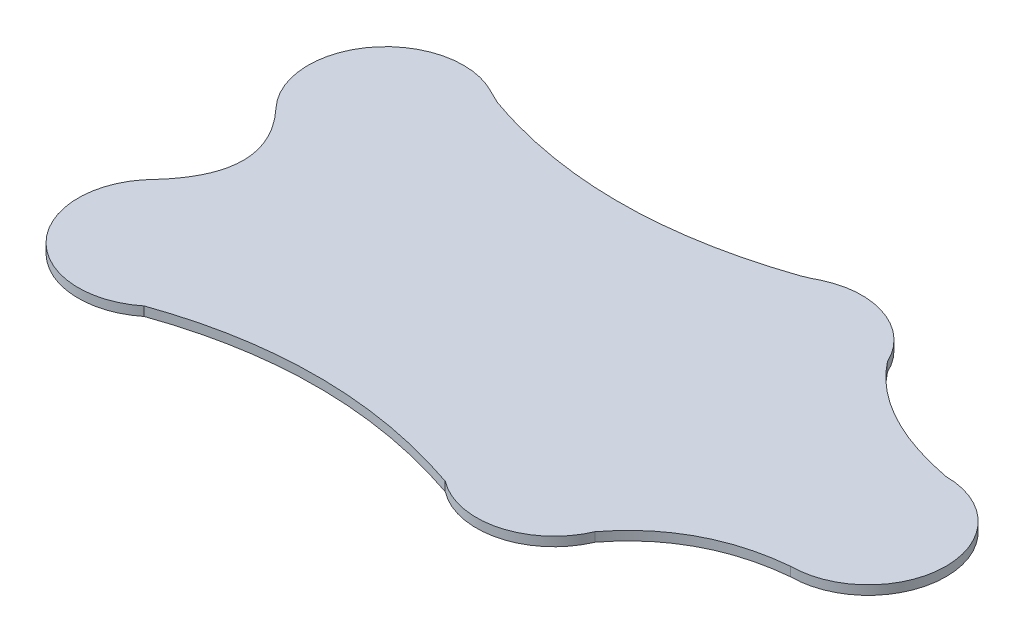
ISO-10303-21;
HEADER;
FILE_DESCRIPTION(('STEP AP214'),'2;1');
FILE_NAME('part.step','',(''),(''),'','','');
FILE_SCHEMA(('AUTOMOTIVE_DESIGN { 1 0 10303 214 1 1 1 1 }'));
ENDSEC;
DATA;
#1=APPLICATION_CONTEXT('core data for automotive mechanical design processes');
#2=APPLICATION_PROTOCOL_DEFINITION('international standard','automotive_design',2000,#1);
#3=PRODUCT_CONTEXT('',#1,'mechanical');
#4=PRODUCT('Part','Part','',(#3));
#5=PRODUCT_RELATED_PRODUCT_CATEGORY('part','',(#4));
#6=PRODUCT_DEFINITION_FORMATION('','',#4);
#7=PRODUCT_DEFINITION_CONTEXT('part definition',#1,'design');
#8=PRODUCT_DEFINITION('design','',#6,#7);
#9=PRODUCT_DEFINITION_SHAPE('','',#8);
#10=(LENGTH_UNIT() NAMED_UNIT(*) SI_UNIT(.MILLI.,.METRE.));
#11=(NAMED_UNIT(*) PLANE_ANGLE_UNIT() SI_UNIT($,.RADIAN.));
#12=(NAMED_UNIT(*) SI_UNIT($,.STERADIAN.) SOLID_ANGLE_UNIT());
#13=UNCERTAINTY_MEASURE_WITH_UNIT(LENGTH_MEASURE(1.E-05),#10,'distance_accuracy_value','');
#14=(GEOMETRIC_REPRESENTATION_CONTEXT(3) GLOBAL_UNCERTAINTY_ASSIGNED_CONTEXT((#13)) GLOBAL_UNIT_ASSIGNED_CONTEXT((#10,
#11,#12)) REPRESENTATION_CONTEXT('',''));
#15=CARTESIAN_POINT('',(0.,0.,0.));
#16=DIRECTION('',(0.,0.,1.));
#17=DIRECTION('',(1.,0.,0.));
#18=AXIS2_PLACEMENT_3D('',#15,#16,#17);
#19=CARTESIAN_POINT('',(-81.4040212943642,1.,-17.6380629619803));
#20=CARTESIAN_POINT('',(-75.1583726888468,1.,-11.0024776715556));
#21=CARTESIAN_POINT('',(-81.269993216032,1.,-4.2788418677839));
#22=B_SPLINE_CURVE_WITH_KNOTS('',2,(#19,#20,#21),.UNSPECIFIED.,.F.,.F.,(3,3),(0.,1.),.UNSPECIFIED.);
#23=DIRECTION('',(0.,-1.,0.));
#24=VECTOR('',#23,1.);
#25=SURFACE_OF_LINEAR_EXTRUSION('',#22,#24);
#26=CARTESIAN_POINT('',(-81.4040212943642,0.,-17.6380629619803));
#27=CARTESIAN_POINT('',(-75.1583726888468,0.,-11.0024776715556));
#28=CARTESIAN_POINT('',(-81.269993216032,0.,-4.2788418677839));
#29=B_SPLINE_CURVE_WITH_KNOTS('',2,(#26,#27,#28),.UNSPECIFIED.,.F.,.F.,(3,3),(0.,1.),.UNSPECIFIED.);
#30=CARTESIAN_POINT('',(-81.4040212943642,0.,-17.6380629619803));
#31=VERTEX_POINT('',#30);
#32=CARTESIAN_POINT('',(-81.269993216032,0.,-4.2788418677839));
#33=VERTEX_POINT('',#32);
#34=EDGE_CURVE('E256',#31,#33,#29,.T.);
#35=ORIENTED_EDGE('',*,*,#34,.T.);
#36=DIRECTION('',(0.,-1.,0.));
#37=VECTOR('',#36,1.);
#38=CARTESIAN_POINT('',(-81.269993216032,1.,-4.2788418677839));
#39=LINE('',#38,#37);
#40=CARTESIAN_POINT('',(-81.269993216032,1.,-4.2788418677839));
#41=VERTEX_POINT('',#40);
#42=EDGE_CURVE('E11',#41,#33,#39,.T.);
#43=ORIENTED_EDGE('',*,*,#42,.F.);
#44=CARTESIAN_POINT('',(-81.4040212943642,1.,-17.6380629619803));
#45=VERTEX_POINT('',#44);
#46=EDGE_CURVE('E311',#45,#41,#22,.T.);
#47=ORIENTED_EDGE('',*,*,#46,.F.);
#48=DIRECTION('',(0.,-1.,0.));
#49=VECTOR('',#48,1.);
#50=CARTESIAN_POINT('',(-81.4040212943642,1.,-17.6380629619803));
#51=LINE('',#50,#49);
#52=EDGE_CURVE('E160',#45,#31,#51,.T.);
#53=ORIENTED_EDGE('',*,*,#52,.T.);
#54=EDGE_LOOP('',(#35,#43,#47,#53));
#55=FACE_BOUND('',#54,.T.);
#56=ADVANCED_FACE('F43',(#55),#25,.F.);
#57=CARTESIAN_POINT('',(-75.2145037837966,1.,1.68614327352914));
#58=DIRECTION('',(0.,-1.,0.));
#59=DIRECTION('',(0.,0.,-1.));
#60=AXIS2_PLACEMENT_3D('',#57,#58,#59);
#61=CYLINDRICAL_SURFACE('',#60,8.50000000000001);
#62=CARTESIAN_POINT('',(-75.2145037837966,0.,1.68614327352914));
#63=DIRECTION('',(0.,1.,0.));
#64=DIRECTION('',(0.,0.,1.));
#65=AXIS2_PLACEMENT_3D('',#62,#63,#64);
#66=CIRCLE('',#65,8.50000000000001);
#67=CARTESIAN_POINT('',(-69.8761841961678,0.,8.30069873707609));
#68=VERTEX_POINT('',#67);
#69=EDGE_CURVE('E247',#33,#68,#66,.T.);
#70=ORIENTED_EDGE('',*,*,#69,.T.);
#71=DIRECTION('',(0.,-1.,0.));
#72=VECTOR('',#71,1.);
#73=CARTESIAN_POINT('',(-69.8761841961678,1.,8.30069873707609));
#74=LINE('',#73,#72);
#75=CARTESIAN_POINT('',(-69.8761841961678,1.,8.30069873707609));
#76=VERTEX_POINT('',#75);
#77=EDGE_CURVE('E52',#76,#68,#74,.T.);
#78=ORIENTED_EDGE('',*,*,#77,.F.);
#79=CARTESIAN_POINT('',(-75.2145037837966,1.,1.68614327352914));
#80=DIRECTION('',(0.,1.,0.));
#81=DIRECTION('',(0.,0.,1.));
#82=AXIS2_PLACEMENT_3D('',#79,#80,#81);
#83=CIRCLE('',#82,8.50000000000001);
#84=EDGE_CURVE('E115',#41,#76,#83,.T.);
#85=ORIENTED_EDGE('',*,*,#84,.F.);
#86=ORIENTED_EDGE('',*,*,#42,.T.);
#87=EDGE_LOOP('',(#70,#78,#85,#86));
#88=FACE_BOUND('',#87,.T.);
#89=ADVANCED_FACE('F240',(#88),#61,.T.);
#90=CARTESIAN_POINT('',(-69.8761841961678,1.,8.30069873707609));
#91=CARTESIAN_POINT('',(-53.7895382824083,1.,2.61337098344057));
#92=CARTESIAN_POINT('',(-36.8161886656417,1.,8.43861551590107));
#93=B_SPLINE_CURVE_WITH_KNOTS('',2,(#90,#91,#92),.UNSPECIFIED.,.F.,.F.,(3,3),(0.,1.),.UNSPECIFIED.);
#94=DIRECTION('',(0.,-1.,0.));
#95=VECTOR('',#94,1.);
#96=SURFACE_OF_LINEAR_EXTRUSION('',#93,#95);
#97=CARTESIAN_POINT('',(-69.8761841961678,0.,8.30069873707609));
#98=CARTESIAN_POINT('',(-53.7895382824083,0.,2.61337098344057));
#99=CARTESIAN_POINT('',(-36.8161886656417,0.,8.43861551590107));
#100=B_SPLINE_CURVE_WITH_KNOTS('',2,(#97,#98,#99),.UNSPECIFIED.,.F.,.F.,(3,3),(0.,1.),.UNSPECIFIED.);
#101=CARTESIAN_POINT('',(-36.8161886656417,0.,8.43861551590107));
#102=VERTEX_POINT('',#101);
#103=EDGE_CURVE('E255',#68,#102,#100,.T.);
#104=ORIENTED_EDGE('',*,*,#103,.T.);
#105=DIRECTION('',(0.,-1.,0.));
#106=VECTOR('',#105,1.);
#107=CARTESIAN_POINT('',(-36.8161886656417,1.,8.43861551590107));
#108=LINE('',#107,#106);
#109=CARTESIAN_POINT('',(-36.8161886656417,1.,8.43861551590107));
#110=VERTEX_POINT('',#109);
#111=EDGE_CURVE('E260',#110,#102,#108,.T.);
#112=ORIENTED_EDGE('',*,*,#111,.F.);
#113=EDGE_CURVE('E230',#76,#110,#93,.T.);
#114=ORIENTED_EDGE('',*,*,#113,.F.);
#115=ORIENTED_EDGE('',*,*,#77,.T.);
#116=EDGE_LOOP('',(#104,#112,#114,#115));
#117=FACE_BOUND('',#116,.T.);
#118=ADVANCED_FACE('F238',(#117),#96,.F.);
#119=CARTESIAN_POINT('',(-31.6534259734393,1.,1.68614327352914));
#120=DIRECTION('',(0.,-1.,0.));
#121=DIRECTION('',(0.,0.,-1.));
#122=AXIS2_PLACEMENT_3D('',#119,#120,#121);
#123=CYLINDRICAL_SURFACE('',#122,8.5);
#124=CARTESIAN_POINT('',(-31.6534259734393,0.,1.68614327352914));
#125=DIRECTION('',(0.,1.,0.));
#126=DIRECTION('',(0.,0.,1.));
#127=AXIS2_PLACEMENT_3D('',#124,#125,#126);
#128=CIRCLE('',#127,8.5);
#129=CARTESIAN_POINT('',(-23.8356452669363,0.,5.02265414943365));
#130=VERTEX_POINT('',#129);
#131=EDGE_CURVE('E264',#102,#130,#128,.T.);
#132=ORIENTED_EDGE('',*,*,#131,.T.);
#133=DIRECTION('',(0.,-1.,0.));
#134=VECTOR('',#133,1.);
#135=CARTESIAN_POINT('',(-23.8356452669363,1.,5.02265414943365));
#136=LINE('',#135,#134);
#137=CARTESIAN_POINT('',(-23.8356452669363,1.,5.02265414943365));
#138=VERTEX_POINT('',#137);
#139=EDGE_CURVE('E327',#138,#130,#136,.T.);
#140=ORIENTED_EDGE('',*,*,#139,.F.);
#141=CARTESIAN_POINT('',(-31.6534259734393,1.,1.68614327352914));
#142=DIRECTION('',(0.,1.,0.));
#143=DIRECTION('',(0.,0.,1.));
#144=AXIS2_PLACEMENT_3D('',#141,#142,#143);
#145=CIRCLE('',#144,8.5);
#146=EDGE_CURVE('E225',#110,#138,#145,.T.);
#147=ORIENTED_EDGE('',*,*,#146,.F.);
#148=ORIENTED_EDGE('',*,*,#111,.T.);
#149=EDGE_LOOP('',(#132,#140,#147,#148));
#150=FACE_BOUND('',#149,.T.);
#151=ADVANCED_FACE('F217',(#150),#123,.T.);
#152=CARTESIAN_POINT('',(-23.8356452669363,1.,5.02265414943365));
#153=CARTESIAN_POINT('',(-18.7887329931189,1.,-1.55157428110118));
#154=CARTESIAN_POINT('',(-9.87288706826068,1.,-2.38885672647085));
#155=B_SPLINE_CURVE_WITH_KNOTS('',2,(#152,#153,#154),.UNSPECIFIED.,.F.,.F.,(3,3),(0.,1.),.UNSPECIFIED.);
#156=DIRECTION('',(0.,-1.,0.));
#157=VECTOR('',#156,1.);
#158=SURFACE_OF_LINEAR_EXTRUSION('',#155,#157);
#159=CARTESIAN_POINT('',(-23.8356452669363,0.,5.02265414943365));
#160=CARTESIAN_POINT('',(-18.7887329931189,0.,-1.55157428110118));
#161=CARTESIAN_POINT('',(-9.87288706826068,0.,-2.38885672647085));
#162=B_SPLINE_CURVE_WITH_KNOTS('',2,(#159,#160,#161),.UNSPECIFIED.,.F.,.F.,(3,3),(0.,1.),.UNSPECIFIED.);
#163=CARTESIAN_POINT('',(-9.87288706826068,0.,-2.38885672647085));
#164=VERTEX_POINT('',#163);
#165=EDGE_CURVE('E266',#130,#164,#162,.T.);
#166=ORIENTED_EDGE('',*,*,#165,.T.);
#167=DIRECTION('',(0.,-1.,0.));
#168=VECTOR('',#167,1.);
#169=CARTESIAN_POINT('',(-9.87288706826068,1.,-2.38885672647085));
#170=LINE('',#169,#168);
#171=CARTESIAN_POINT('',(-9.87288706826068,1.,-2.38885672647085));
#172=VERTEX_POINT('',#171);
#173=EDGE_CURVE('E324',#172,#164,#170,.T.);
#174=ORIENTED_EDGE('',*,*,#173,.F.);
#175=EDGE_CURVE('E220',#138,#172,#155,.T.);
#176=ORIENTED_EDGE('',*,*,#175,.F.);
#177=ORIENTED_EDGE('',*,*,#139,.T.);
#178=EDGE_LOOP('',(#166,#174,#176,#177));
#179=FACE_BOUND('',#178,.T.);
#180=ADVANCED_FACE('F213',(#179),#158,.F.);
#181=CARTESIAN_POINT('',(-9.87288706826068,1.,-10.8888567264709));
#182=DIRECTION('',(0.,-1.,0.));
#183=DIRECTION('',(0.,0.,-1.));
#184=AXIS2_PLACEMENT_3D('',#181,#182,#183);
#185=CYLINDRICAL_SURFACE('',#184,8.5);
#186=CARTESIAN_POINT('',(-9.87288706826068,0.,-10.8888567264709));
#187=DIRECTION('',(0.,1.,0.));
#188=DIRECTION('',(0.,0.,1.));
#189=AXIS2_PLACEMENT_3D('',#186,#187,#188);
#190=CIRCLE('',#189,8.5);
#191=CARTESIAN_POINT('',(-9.87288706826068,0.,-19.3888567264709));
#192=VERTEX_POINT('',#191);
#193=EDGE_CURVE('E277',#164,#192,#190,.T.);
#194=ORIENTED_EDGE('',*,*,#193,.T.);
#195=DIRECTION('',(0.,-1.,0.));
#196=VECTOR('',#195,1.);
#197=CARTESIAN_POINT('',(-9.87288706826068,1.,-19.3888567264709));
#198=LINE('',#197,#196);
#199=CARTESIAN_POINT('',(-9.87288706826068,1.,-19.3888567264709));
#200=VERTEX_POINT('',#199);
#201=EDGE_CURVE('E321',#200,#192,#198,.T.);
#202=ORIENTED_EDGE('',*,*,#201,.F.);
#203=CARTESIAN_POINT('',(-9.87288706826068,1.,-10.8888567264709));
#204=DIRECTION('',(0.,1.,0.));
#205=DIRECTION('',(0.,0.,1.));
#206=AXIS2_PLACEMENT_3D('',#203,#204,#205);
#207=CIRCLE('',#206,8.5);
#208=EDGE_CURVE('E201',#172,#200,#207,.T.);
#209=ORIENTED_EDGE('',*,*,#208,.F.);
#210=ORIENTED_EDGE('',*,*,#173,.T.);
#211=EDGE_LOOP('',(#194,#202,#209,#210));
#212=FACE_BOUND('',#211,.T.);
#213=ADVANCED_FACE('F209',(#212),#185,.T.);
#214=CARTESIAN_POINT('',(-9.87288706826068,1.,-19.3888567264709));
#215=CARTESIAN_POINT('',(-19.3556952476072,1.,-21.2032847087823));
#216=CARTESIAN_POINT('',(-23.9530413454434,1.,-27.0630339353512));
#217=B_SPLINE_CURVE_WITH_KNOTS('',2,(#214,#215,#216),.UNSPECIFIED.,.F.,.F.,(3,3),(0.,1.),.UNSPECIFIED.);
#218=DIRECTION('',(0.,-1.,0.));
#219=VECTOR('',#218,1.);
#220=SURFACE_OF_LINEAR_EXTRUSION('',#217,#219);
#221=CARTESIAN_POINT('',(-9.87288706826068,0.,-19.3888567264709));
#222=CARTESIAN_POINT('',(-19.3556952476072,0.,-21.2032847087823));
#223=CARTESIAN_POINT('',(-23.9530413454434,0.,-27.0630339353512));
#224=B_SPLINE_CURVE_WITH_KNOTS('',2,(#221,#222,#223),.UNSPECIFIED.,.F.,.F.,(3,3),(0.,1.),.UNSPECIFIED.);
#225=CARTESIAN_POINT('',(-23.9530413454434,0.,-27.0630339353512));
#226=VERTEX_POINT('',#225);
#227=EDGE_CURVE('E282',#192,#226,#224,.T.);
#228=ORIENTED_EDGE('',*,*,#227,.T.);
#229=DIRECTION('',(0.,-1.,0.));
#230=VECTOR('',#229,1.);
#231=CARTESIAN_POINT('',(-23.9530413454434,1.,-27.0630339353512));
#232=LINE('',#231,#230);
#233=CARTESIAN_POINT('',(-23.9530413454434,1.,-27.0630339353512));
#234=VERTEX_POINT('',#233);
#235=EDGE_CURVE('E318',#234,#226,#232,.T.);
#236=ORIENTED_EDGE('',*,*,#235,.F.);
#237=EDGE_CURVE('E196',#200,#234,#217,.T.);
#238=ORIENTED_EDGE('',*,*,#237,.F.);
#239=ORIENTED_EDGE('',*,*,#201,.T.);
#240=EDGE_LOOP('',(#228,#236,#238,#239));
#241=FACE_BOUND('',#240,.T.);
#242=ADVANCED_FACE('F206',(#241),#220,.F.);
#243=CARTESIAN_POINT('',(-31.6534259734393,1.,-23.4638567264709));
#244=DIRECTION('',(0.,-1.,0.));
#245=DIRECTION('',(0.,0.,-1.));
#246=AXIS2_PLACEMENT_3D('',#243,#244,#245);
#247=CYLINDRICAL_SURFACE('',#246,8.5);
#248=CARTESIAN_POINT('',(-31.6534259734393,0.,-23.4638567264709));
#249=DIRECTION('',(0.,1.,0.));
#250=DIRECTION('',(0.,0.,1.));
#251=AXIS2_PLACEMENT_3D('',#248,#249,#250);
#252=CIRCLE('',#251,8.5);
#253=CARTESIAN_POINT('',(-35.2696324597708,0.,-31.1562588641788));
#254=VERTEX_POINT('',#253);
#255=EDGE_CURVE('E286',#226,#254,#252,.T.);
#256=ORIENTED_EDGE('',*,*,#255,.T.);
#257=DIRECTION('',(0.,-1.,0.));
#258=VECTOR('',#257,1.);
#259=CARTESIAN_POINT('',(-35.2696324597708,1.,-31.1562588641788));
#260=LINE('',#259,#258);
#261=CARTESIAN_POINT('',(-35.2696324597708,1.,-31.1562588641788));
#262=VERTEX_POINT('',#261);
#263=EDGE_CURVE('E315',#262,#254,#260,.T.);
#264=ORIENTED_EDGE('',*,*,#263,.F.);
#265=CARTESIAN_POINT('',(-31.6534259734393,1.,-23.4638567264709));
#266=DIRECTION('',(0.,1.,0.));
#267=DIRECTION('',(0.,0.,1.));
#268=AXIS2_PLACEMENT_3D('',#265,#266,#267);
#269=CIRCLE('',#268,8.5);
#270=EDGE_CURVE('E191',#234,#262,#269,.T.);
#271=ORIENTED_EDGE('',*,*,#270,.F.);
#272=ORIENTED_EDGE('',*,*,#235,.T.);
#273=EDGE_LOOP('',(#256,#264,#271,#272));
#274=FACE_BOUND('',#273,.T.);
#275=ADVANCED_FACE('F184',(#274),#247,.T.);
#276=CARTESIAN_POINT('',(-35.2696324597708,1.,-31.1562588641788));
#277=CARTESIAN_POINT('',(-36.0218956805531,1.,-30.7555504666887));
#278=CARTESIAN_POINT('',(-36.8161886656417,1.,-30.4435708590123));
#279=B_SPLINE_CURVE_WITH_KNOTS('',2,(#276,#277,#278),.UNSPECIFIED.,.F.,.F.,(3,3),(0.,1.),.UNSPECIFIED.);
#280=DIRECTION('',(0.,-1.,0.));
#281=VECTOR('',#280,1.);
#282=SURFACE_OF_LINEAR_EXTRUSION('',#279,#281);
#283=CARTESIAN_POINT('',(-35.2696324597708,0.,-31.1562588641788));
#284=CARTESIAN_POINT('',(-36.0218956805531,0.,-30.7555504666887));
#285=CARTESIAN_POINT('',(-36.8161886656417,0.,-30.4435708590123));
#286=B_SPLINE_CURVE_WITH_KNOTS('',2,(#283,#284,#285),.UNSPECIFIED.,.F.,.F.,(3,3),(0.,1.),.UNSPECIFIED.);
#287=CARTESIAN_POINT('',(-36.8161886656417,0.,-30.4435708590123));
#288=VERTEX_POINT('',#287);
#289=EDGE_CURVE('E291',#254,#288,#286,.T.);
#290=ORIENTED_EDGE('',*,*,#289,.T.);
#291=DIRECTION('',(0.,-1.,0.));
#292=VECTOR('',#291,1.);
#293=CARTESIAN_POINT('',(-36.8161886656417,1.,-30.4435708590123));
#294=LINE('',#293,#292);
#295=CARTESIAN_POINT('',(-36.8161886656417,1.,-30.4435708590123));
#296=VERTEX_POINT('',#295);
#297=EDGE_CURVE('E155',#296,#288,#294,.T.);
#298=ORIENTED_EDGE('',*,*,#297,.F.);
#299=EDGE_CURVE('E146',#262,#296,#279,.T.);
#300=ORIENTED_EDGE('',*,*,#299,.F.);
#301=ORIENTED_EDGE('',*,*,#263,.T.);
#302=EDGE_LOOP('',(#290,#298,#300,#301));
#303=FACE_BOUND('',#302,.T.);
#304=ADVANCED_FACE('F181',(#303),#282,.F.);
#305=CARTESIAN_POINT('',(-36.8161886656417,1.,-30.4435708590123));
#306=CARTESIAN_POINT('',(-53.7895382824083,1.,-24.6183263265518));
#307=CARTESIAN_POINT('',(-69.8761841961678,1.,-30.3056540801873));
#308=B_SPLINE_CURVE_WITH_KNOTS('',2,(#305,#306,#307),.UNSPECIFIED.,.F.,.F.,(3,3),(0.,1.),.UNSPECIFIED.);
#309=DIRECTION('',(0.,-1.,0.));
#310=VECTOR('',#309,1.);
#311=SURFACE_OF_LINEAR_EXTRUSION('',#308,#310);
#312=CARTESIAN_POINT('',(-36.8161886656417,0.,-30.4435708590123));
#313=CARTESIAN_POINT('',(-53.7895382824083,0.,-24.6183263265518));
#314=CARTESIAN_POINT('',(-69.8761841961678,0.,-30.3056540801873));
#315=B_SPLINE_CURVE_WITH_KNOTS('',2,(#312,#313,#314),.UNSPECIFIED.,.F.,.F.,(3,3),(0.,1.),.UNSPECIFIED.);
#316=CARTESIAN_POINT('',(-69.8761841961678,0.,-30.3056540801873));
#317=VERTEX_POINT('',#316);
#318=EDGE_CURVE('E154',#288,#317,#315,.T.);
#319=ORIENTED_EDGE('',*,*,#318,.T.);
#320=DIRECTION('',(0.,-1.,0.));
#321=VECTOR('',#320,1.);
#322=CARTESIAN_POINT('',(-69.8761841961678,1.,-30.3056540801873));
#323=LINE('',#322,#321);
#324=CARTESIAN_POINT('',(-69.8761841961678,1.,-30.3056540801873));
#325=VERTEX_POINT('',#324);
#326=EDGE_CURVE('E151',#325,#317,#323,.T.);
#327=ORIENTED_EDGE('',*,*,#326,.F.);
#328=EDGE_CURVE('E140',#296,#325,#308,.T.);
#329=ORIENTED_EDGE('',*,*,#328,.F.);
#330=ORIENTED_EDGE('',*,*,#297,.T.);
#331=EDGE_LOOP('',(#319,#327,#329,#330));
#332=FACE_BOUND('',#331,.T.);
#333=ADVANCED_FACE('F152',(#332),#311,.F.);
#334=CARTESIAN_POINT('',(-69.8761841961678,1.,-30.3056540801873));
#335=CARTESIAN_POINT('',(-70.6532818173494,1.,-30.6898681037123));
#336=CARTESIAN_POINT('',(-71.1829411423227,1.,-30.9469378210382));
#337=B_SPLINE_CURVE_WITH_KNOTS('',2,(#334,#335,#336),.UNSPECIFIED.,.F.,.F.,(3,3),(0.,1.),.UNSPECIFIED.);
#338=DIRECTION('',(0.,-1.,0.));
#339=VECTOR('',#338,1.);
#340=SURFACE_OF_LINEAR_EXTRUSION('',#337,#339);
#341=CARTESIAN_POINT('',(-69.8761841961678,0.,-30.3056540801873));
#342=CARTESIAN_POINT('',(-70.6532818173494,0.,-30.6898681037123));
#343=CARTESIAN_POINT('',(-71.1829411423227,0.,-30.9469378210382));
#344=B_SPLINE_CURVE_WITH_KNOTS('',2,(#341,#342,#343),.UNSPECIFIED.,.F.,.F.,(3,3),(0.,1.),.UNSPECIFIED.);
#345=CARTESIAN_POINT('',(-71.1829411423227,0.,-30.9469378210383));
#346=VERTEX_POINT('',#345);
#347=EDGE_CURVE('E101',#317,#346,#344,.T.);
#348=ORIENTED_EDGE('',*,*,#347,.T.);
#349=DIRECTION('',(0.,-1.,0.));
#350=VECTOR('',#349,1.);
#351=CARTESIAN_POINT('',(-71.1829411423227,1.,-30.9469378210383));
#352=LINE('',#351,#350);
#353=CARTESIAN_POINT('',(-71.1829411423227,1.,-30.9469378210383));
#354=VERTEX_POINT('',#353);
#355=EDGE_CURVE('E156',#354,#346,#352,.T.);
#356=ORIENTED_EDGE('',*,*,#355,.F.);
#357=EDGE_CURVE('E144',#325,#354,#337,.T.);
#358=ORIENTED_EDGE('',*,*,#357,.F.);
#359=ORIENTED_EDGE('',*,*,#326,.T.);
#360=EDGE_LOOP('',(#348,#356,#358,#359));
#361=FACE_BOUND('',#360,.T.);
#362=ADVANCED_FACE('F158',(#361),#340,.F.);
#363=CARTESIAN_POINT('',(-75.2145037837966,1.,-23.4638567264709));
#364=DIRECTION('',(0.,-1.,0.));
#365=DIRECTION('',(0.,0.,-1.));
#366=AXIS2_PLACEMENT_3D('',#363,#364,#365);
#367=CYLINDRICAL_SURFACE('',#366,8.50000000000001);
#368=CARTESIAN_POINT('',(-75.2145037837966,0.,-23.4638567264709));
#369=DIRECTION('',(0.,1.,0.));
#370=DIRECTION('',(0.,0.,1.));
#371=AXIS2_PLACEMENT_3D('',#368,#369,#370);
#372=CIRCLE('',#371,8.50000000000001);
#373=EDGE_CURVE('E107',#346,#31,#372,.T.);
#374=ORIENTED_EDGE('',*,*,#373,.T.);
#375=ORIENTED_EDGE('',*,*,#52,.F.);
#376=CARTESIAN_POINT('',(-75.2145037837966,1.,-23.4638567264709));
#377=DIRECTION('',(0.,1.,0.));
#378=DIRECTION('',(0.,0.,1.));
#379=AXIS2_PLACEMENT_3D('',#376,#377,#378);
#380=CIRCLE('',#379,8.50000000000001);
#381=EDGE_CURVE('E60',#354,#45,#380,.T.);
#382=ORIENTED_EDGE('',*,*,#381,.F.);
#383=ORIENTED_EDGE('',*,*,#355,.T.);
#384=EDGE_LOOP('',(#374,#375,#382,#383));
#385=FACE_BOUND('',#384,.T.);
#386=ADVANCED_FACE('F177',(#385),#367,.T.);
#387=CARTESIAN_POINT('',(-78.2476899720224,1.,-10.9804650432188));
#388=DIRECTION('',(0.,1.,0.));
#389=DIRECTION('',(0.,0.,1.));
#390=AXIS2_PLACEMENT_3D('',#387,#388,#389);
#391=PLANE('',#390);
#392=ORIENTED_EDGE('',*,*,#46,.T.);
#393=ORIENTED_EDGE('',*,*,#84,.T.);
#394=ORIENTED_EDGE('',*,*,#113,.T.);
#395=ORIENTED_EDGE('',*,*,#146,.T.);
#396=ORIENTED_EDGE('',*,*,#175,.T.);
#397=ORIENTED_EDGE('',*,*,#208,.T.);
#398=ORIENTED_EDGE('',*,*,#237,.T.);
#399=ORIENTED_EDGE('',*,*,#270,.T.);
#400=ORIENTED_EDGE('',*,*,#299,.T.);
#401=ORIENTED_EDGE('',*,*,#328,.T.);
#402=ORIENTED_EDGE('',*,*,#357,.T.);
#403=ORIENTED_EDGE('',*,*,#381,.T.);
#404=EDGE_LOOP('',(#392,#393,#394,#395,#396,#397,#398,#399,#400,#401,#402,#403));
#405=FACE_BOUND('',#404,.T.);
#406=ADVANCED_FACE('F142',(#405),#391,.T.);
#407=CARTESIAN_POINT('',(-78.2476899720224,0.,-10.9804650432188));
#408=DIRECTION('',(0.,1.,0.));
#409=DIRECTION('',(0.,0.,1.));
#410=AXIS2_PLACEMENT_3D('',#407,#408,#409);
#411=PLANE('',#410);
#412=ORIENTED_EDGE('',*,*,#34,.F.);
#413=ORIENTED_EDGE('',*,*,#373,.F.);
#414=ORIENTED_EDGE('',*,*,#347,.F.);
#415=ORIENTED_EDGE('',*,*,#318,.F.);
#416=ORIENTED_EDGE('',*,*,#289,.F.);
#417=ORIENTED_EDGE('',*,*,#255,.F.);
#418=ORIENTED_EDGE('',*,*,#227,.F.);
#419=ORIENTED_EDGE('',*,*,#193,.F.);
#420=ORIENTED_EDGE('',*,*,#165,.F.);
#421=ORIENTED_EDGE('',*,*,#131,.F.);
#422=ORIENTED_EDGE('',*,*,#103,.F.);
#423=ORIENTED_EDGE('',*,*,#69,.F.);
#424=EDGE_LOOP('',(#412,#413,#414,#415,#416,#417,#418,#419,#420,#421,#422,#423));
#425=FACE_BOUND('',#424,.T.);
#426=ADVANCED_FACE('F262',(#425),#411,.F.);
#427=CLOSED_SHELL('',(#56,#89,#118,#151,#180,#213,#242,#275,#304,#333,#362,#386,#406,#426));
#428=MANIFOLD_SOLID_BREP('B2',#427);
#429=ADVANCED_BREP_SHAPE_REPRESENTATION('',(#18,#428),#14);
#430=SHAPE_DEFINITION_REPRESENTATION(#9,#429);
ENDSEC;
END-ISO-10303-21;
